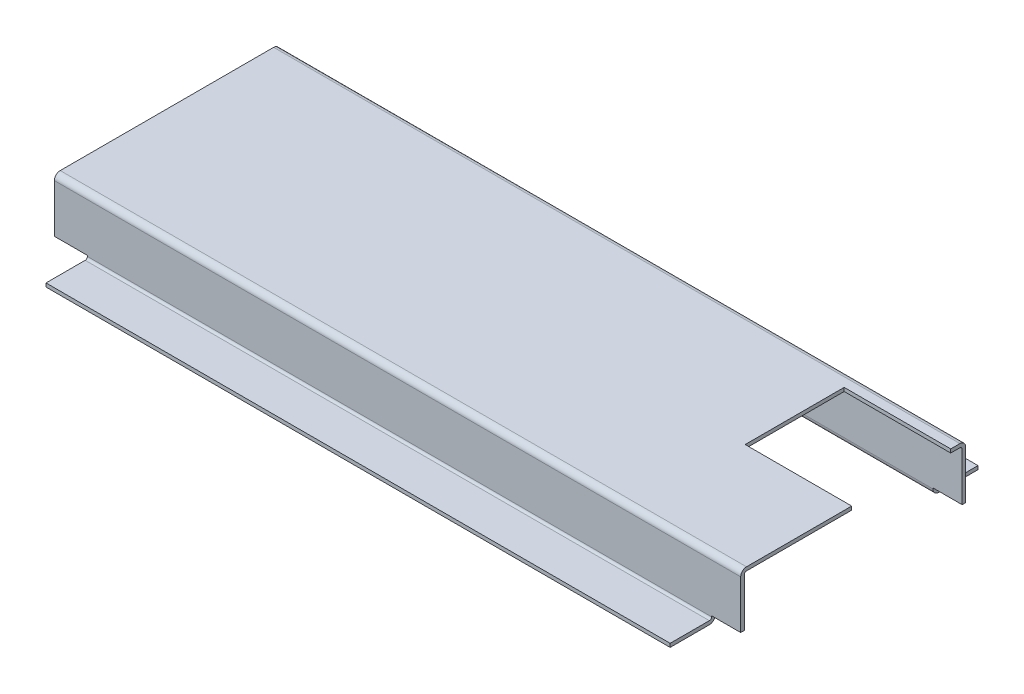
ISO-10303-21;
HEADER;
FILE_DESCRIPTION(('STEP AP214'),'2;1');
FILE_NAME('part.step','',(''),(''),'','','');
FILE_SCHEMA(('AUTOMOTIVE_DESIGN { 1 0 10303 214 1 1 1 1 }'));
ENDSEC;
DATA;
#1=APPLICATION_CONTEXT('core data for automotive mechanical design processes');
#2=APPLICATION_PROTOCOL_DEFINITION('international standard','automotive_design',2000,#1);
#3=PRODUCT_CONTEXT('',#1,'mechanical');
#4=PRODUCT('Part','Part','',(#3));
#5=PRODUCT_RELATED_PRODUCT_CATEGORY('part','',(#4));
#6=PRODUCT_DEFINITION_FORMATION('','',#4);
#7=PRODUCT_DEFINITION_CONTEXT('part definition',#1,'design');
#8=PRODUCT_DEFINITION('design','',#6,#7);
#9=PRODUCT_DEFINITION_SHAPE('','',#8);
#10=(LENGTH_UNIT() NAMED_UNIT(*) SI_UNIT(.MILLI.,.METRE.));
#11=(NAMED_UNIT(*) PLANE_ANGLE_UNIT() SI_UNIT($,.RADIAN.));
#12=(NAMED_UNIT(*) SI_UNIT($,.STERADIAN.) SOLID_ANGLE_UNIT());
#13=UNCERTAINTY_MEASURE_WITH_UNIT(LENGTH_MEASURE(1.E-05),#10,'distance_accuracy_value','');
#14=(GEOMETRIC_REPRESENTATION_CONTEXT(3) GLOBAL_UNCERTAINTY_ASSIGNED_CONTEXT((#13)) GLOBAL_UNIT_ASSIGNED_CONTEXT((#10,
#11,#12)) REPRESENTATION_CONTEXT('',''));
#15=CARTESIAN_POINT('',(0.,0.,0.));
#16=DIRECTION('',(0.,0.,1.));
#17=DIRECTION('',(1.,0.,0.));
#18=AXIS2_PLACEMENT_3D('',#15,#16,#17);
#19=CARTESIAN_POINT('',(-106.22,-18.0141,67.2));
#20=DIRECTION('',(1.,0.,0.));
#21=DIRECTION('',(0.,0.,-1.));
#22=AXIS2_PLACEMENT_3D('',#19,#20,#21);
#23=PLANE('',#22);
#24=DIRECTION('',(0.,0.,-1.));
#25=VECTOR('',#24,1.);
#26=CARTESIAN_POINT('',(-106.22,-18.0141,67.2));
#27=LINE('',#26,#25);
#28=CARTESIAN_POINT('',(-106.22,-18.0141,37.5));
#29=VERTEX_POINT('',#28);
#30=CARTESIAN_POINT('',(-106.22,-18.0141,36.3));
#31=VERTEX_POINT('',#30);
#32=EDGE_CURVE('E20',#29,#31,#27,.T.);
#33=ORIENTED_EDGE('',*,*,#32,.T.);
#34=DIRECTION('',(0.,-1.,0.));
#35=VECTOR('',#34,1.);
#36=CARTESIAN_POINT('',(-106.22,1.36491374571326E-13,36.3));
#37=LINE('',#36,#35);
#38=CARTESIAN_POINT('',(-106.22,-18.3275,36.3));
#39=VERTEX_POINT('',#38);
#40=EDGE_CURVE('E695',#31,#39,#37,.T.);
#41=ORIENTED_EDGE('',*,*,#40,.T.);
#42=CARTESIAN_POINT('',(-106.22,-18.3275,38.2366));
#43=DIRECTION('',(-1.,0.,0.));
#44=DIRECTION('',(0.,0.,-1.));
#45=AXIS2_PLACEMENT_3D('',#42,#43,#44);
#46=CIRCLE('',#45,1.9366);
#47=CARTESIAN_POINT('',(-106.22,-20.2641,38.2366));
#48=VERTEX_POINT('',#47);
#49=EDGE_CURVE('E299',#39,#48,#46,.T.);
#50=ORIENTED_EDGE('',*,*,#49,.T.);
#51=DIRECTION('',(0.,0.,-1.));
#52=VECTOR('',#51,1.);
#53=CARTESIAN_POINT('',(-106.22,-20.2641,0.));
#54=LINE('',#53,#52);
#55=CARTESIAN_POINT('',(-106.22,-20.2641,51.3));
#56=VERTEX_POINT('',#55);
#57=EDGE_CURVE('E297',#56,#48,#54,.T.);
#58=ORIENTED_EDGE('',*,*,#57,.F.);
#59=DIRECTION('',(0.,-1.,0.));
#60=VECTOR('',#59,1.);
#61=CARTESIAN_POINT('',(-106.22,-20.2641,51.3));
#62=LINE('',#61,#60);
#63=CARTESIAN_POINT('',(-106.22,-19.0641,51.3));
#64=VERTEX_POINT('',#63);
#65=EDGE_CURVE('E284',#64,#56,#62,.T.);
#66=ORIENTED_EDGE('',*,*,#65,.F.);
#67=DIRECTION('',(0.,0.,-1.));
#68=VECTOR('',#67,1.);
#69=CARTESIAN_POINT('',(-106.22,-19.0641,0.));
#70=LINE('',#69,#68);
#71=CARTESIAN_POINT('',(-106.22,-19.0641,38.2366));
#72=VERTEX_POINT('',#71);
#73=EDGE_CURVE('E438',#64,#72,#70,.T.);
#74=ORIENTED_EDGE('',*,*,#73,.T.);
#75=CARTESIAN_POINT('',(-106.22,-18.3275,38.2366));
#76=DIRECTION('',(-1.,0.,0.));
#77=DIRECTION('',(0.,0.,-1.));
#78=AXIS2_PLACEMENT_3D('',#75,#76,#77);
#79=CIRCLE('',#78,0.7366);
#80=CARTESIAN_POINT('',(-106.22,-18.3275,37.5));
#81=VERTEX_POINT('',#80);
#82=EDGE_CURVE('E521',#81,#72,#79,.T.);
#83=ORIENTED_EDGE('',*,*,#82,.F.);
#84=DIRECTION('',(0.,-1.,0.));
#85=VECTOR('',#84,1.);
#86=CARTESIAN_POINT('',(-106.22,1.40681152177937E-13,37.5));
#87=LINE('',#86,#85);
#88=EDGE_CURVE('E717',#29,#81,#87,.T.);
#89=ORIENTED_EDGE('',*,*,#88,.F.);
#90=EDGE_LOOP('',(#33,#41,#50,#58,#66,#74,#83,#89));
#91=FACE_BOUND('',#90,.T.);
#92=ADVANCED_FACE('F17',(#91),#23,.F.);
#93=CARTESIAN_POINT('',(-106.22,-18.0141,67.2));
#94=DIRECTION('',(1.,0.,0.));
#95=DIRECTION('',(0.,0.,-1.));
#96=AXIS2_PLACEMENT_3D('',#93,#94,#95);
#97=PLANE('',#96);
#98=CARTESIAN_POINT('',(-106.22,-18.3275,-38.2366));
#99=DIRECTION('',(-1.,0.,0.));
#100=DIRECTION('',(0.,0.,-1.));
#101=AXIS2_PLACEMENT_3D('',#98,#99,#100);
#102=CIRCLE('',#101,0.7366);
#103=CARTESIAN_POINT('',(-106.22,-19.0641,-38.2366));
#104=VERTEX_POINT('',#103);
#105=CARTESIAN_POINT('',(-106.22,-18.3275,-37.5));
#106=VERTEX_POINT('',#105);
#107=EDGE_CURVE('E494',#104,#106,#102,.T.);
#108=ORIENTED_EDGE('',*,*,#107,.F.);
#109=DIRECTION('',(0.,0.,-1.));
#110=VECTOR('',#109,1.);
#111=CARTESIAN_POINT('',(-106.22,-19.0641,0.));
#112=LINE('',#111,#110);
#113=CARTESIAN_POINT('',(-106.22,-19.0641,-51.3));
#114=VERTEX_POINT('',#113);
#115=EDGE_CURVE('E503',#104,#114,#112,.T.);
#116=ORIENTED_EDGE('',*,*,#115,.T.);
#117=DIRECTION('',(0.,1.,0.));
#118=VECTOR('',#117,1.);
#119=CARTESIAN_POINT('',(-106.22,-20.2641,-51.3));
#120=LINE('',#119,#118);
#121=CARTESIAN_POINT('',(-106.22,-20.2641,-51.3));
#122=VERTEX_POINT('',#121);
#123=EDGE_CURVE('E456',#122,#114,#120,.T.);
#124=ORIENTED_EDGE('',*,*,#123,.F.);
#125=DIRECTION('',(0.,0.,-1.));
#126=VECTOR('',#125,1.);
#127=CARTESIAN_POINT('',(-106.22,-20.2641,0.));
#128=LINE('',#127,#126);
#129=CARTESIAN_POINT('',(-106.22,-20.2641,-38.2366));
#130=VERTEX_POINT('',#129);
#131=EDGE_CURVE('E472',#130,#122,#128,.T.);
#132=ORIENTED_EDGE('',*,*,#131,.F.);
#133=CARTESIAN_POINT('',(-106.22,-18.3275,-38.2366));
#134=DIRECTION('',(-1.,0.,0.));
#135=DIRECTION('',(0.,0.,-1.));
#136=AXIS2_PLACEMENT_3D('',#133,#134,#135);
#137=CIRCLE('',#136,1.9366);
#138=CARTESIAN_POINT('',(-106.22,-18.3275,-36.3));
#139=VERTEX_POINT('',#138);
#140=EDGE_CURVE('E486',#130,#139,#137,.T.);
#141=ORIENTED_EDGE('',*,*,#140,.T.);
#142=DIRECTION('',(0.,1.,0.));
#143=VECTOR('',#142,1.);
#144=CARTESIAN_POINT('',(-106.22,1.36491374571326E-13,-36.3));
#145=LINE('',#144,#143);
#146=CARTESIAN_POINT('',(-106.22,-18.0141,-36.3));
#147=VERTEX_POINT('',#146);
#148=EDGE_CURVE('E351',#139,#147,#145,.T.);
#149=ORIENTED_EDGE('',*,*,#148,.T.);
#150=DIRECTION('',(0.,0.,-1.));
#151=VECTOR('',#150,1.);
#152=CARTESIAN_POINT('',(-106.22,-18.0141,67.2));
#153=LINE('',#152,#151);
#154=CARTESIAN_POINT('',(-106.22,-18.0141,-37.5));
#155=VERTEX_POINT('',#154);
#156=EDGE_CURVE('E27',#147,#155,#153,.T.);
#157=ORIENTED_EDGE('',*,*,#156,.T.);
#158=DIRECTION('',(0.,1.,0.));
#159=VECTOR('',#158,1.);
#160=CARTESIAN_POINT('',(-106.22,1.40681152177937E-13,-37.5));
#161=LINE('',#160,#159);
#162=EDGE_CURVE('E327',#106,#155,#161,.T.);
#163=ORIENTED_EDGE('',*,*,#162,.F.);
#164=EDGE_LOOP('',(#108,#116,#124,#132,#141,#149,#157,#163));
#165=FACE_BOUND('',#164,.T.);
#166=ADVANCED_FACE('F618',(#165),#97,.F.);
#167=CARTESIAN_POINT('',(-117.22,1.52233241171181,67.2));
#168=DIRECTION('',(1.,0.,0.));
#169=DIRECTION('',(0.,0.,-1.));
#170=AXIS2_PLACEMENT_3D('',#167,#168,#169);
#171=PLANE('',#170);
#172=DIRECTION('',(0.,0.,-1.));
#173=VECTOR('',#172,1.);
#174=CARTESIAN_POINT('',(-117.22,-18.0141,67.2));
#175=LINE('',#174,#173);
#176=CARTESIAN_POINT('',(-117.22,-18.0141,-36.3));
#177=VERTEX_POINT('',#176);
#178=CARTESIAN_POINT('',(-117.22,-18.0141,-37.5));
#179=VERTEX_POINT('',#178);
#180=EDGE_CURVE('E11',#177,#179,#175,.T.);
#181=ORIENTED_EDGE('',*,*,#180,.F.);
#182=DIRECTION('',(0.,1.,0.));
#183=VECTOR('',#182,1.);
#184=CARTESIAN_POINT('',(-117.22,1.36491374571326E-13,-36.3));
#185=LINE('',#184,#183);
#186=CARTESIAN_POINT('',(-117.22,-1.9366,-36.3));
#187=VERTEX_POINT('',#186);
#188=EDGE_CURVE('E387',#177,#187,#185,.T.);
#189=ORIENTED_EDGE('',*,*,#188,.T.);
#190=CARTESIAN_POINT('',(-117.22,-1.9366,-35.5634));
#191=DIRECTION('',(-1.,0.,0.));
#192=DIRECTION('',(0.,0.,-1.));
#193=AXIS2_PLACEMENT_3D('',#190,#191,#192);
#194=CIRCLE('',#193,0.736599999999983);
#195=CARTESIAN_POINT('',(-117.22,-1.2,-35.5634));
#196=VERTEX_POINT('',#195);
#197=EDGE_CURVE('E343',#196,#187,#194,.T.);
#198=ORIENTED_EDGE('',*,*,#197,.F.);
#199=DIRECTION('',(0.,0.,-1.));
#200=VECTOR('',#199,1.);
#201=CARTESIAN_POINT('',(-117.22,-1.2,0.));
#202=LINE('',#201,#200);
#203=CARTESIAN_POINT('',(-117.22,-1.2,35.5634));
#204=VERTEX_POINT('',#203);
#205=EDGE_CURVE('E417',#204,#196,#202,.T.);
#206=ORIENTED_EDGE('',*,*,#205,.F.);
#207=CARTESIAN_POINT('',(-117.22,-1.9366,35.5634));
#208=DIRECTION('',(-1.,0.,0.));
#209=DIRECTION('',(0.,0.,-1.));
#210=AXIS2_PLACEMENT_3D('',#207,#208,#209);
#211=CIRCLE('',#210,0.736599999999983);
#212=CARTESIAN_POINT('',(-117.22,-1.9366,36.3));
#213=VERTEX_POINT('',#212);
#214=EDGE_CURVE('E481',#213,#204,#211,.T.);
#215=ORIENTED_EDGE('',*,*,#214,.F.);
#216=DIRECTION('',(0.,-1.,0.));
#217=VECTOR('',#216,1.);
#218=CARTESIAN_POINT('',(-117.22,1.36491374571326E-13,36.3));
#219=LINE('',#218,#217);
#220=CARTESIAN_POINT('',(-117.22,-18.0141,36.3));
#221=VERTEX_POINT('',#220);
#222=EDGE_CURVE('E578',#213,#221,#219,.T.);
#223=ORIENTED_EDGE('',*,*,#222,.T.);
#224=DIRECTION('',(0.,0.,-1.));
#225=VECTOR('',#224,1.);
#226=CARTESIAN_POINT('',(-117.22,-18.0141,67.2));
#227=LINE('',#226,#225);
#228=CARTESIAN_POINT('',(-117.22,-18.0141,37.5));
#229=VERTEX_POINT('',#228);
#230=EDGE_CURVE('E352',#229,#221,#227,.T.);
#231=ORIENTED_EDGE('',*,*,#230,.F.);
#232=DIRECTION('',(0.,-1.,0.));
#233=VECTOR('',#232,1.);
#234=CARTESIAN_POINT('',(-117.22,1.40681152177937E-13,37.5));
#235=LINE('',#234,#233);
#236=CARTESIAN_POINT('',(-117.22,-1.9366,37.5));
#237=VERTEX_POINT('',#236);
#238=EDGE_CURVE('E691',#237,#229,#235,.T.);
#239=ORIENTED_EDGE('',*,*,#238,.F.);
#240=CARTESIAN_POINT('',(-117.22,-1.9366,35.5634));
#241=DIRECTION('',(-1.,0.,0.));
#242=DIRECTION('',(0.,0.,-1.));
#243=AXIS2_PLACEMENT_3D('',#240,#241,#242);
#244=CIRCLE('',#243,1.9366);
#245=CARTESIAN_POINT('',(-117.22,0.,35.5634));
#246=VERTEX_POINT('',#245);
#247=EDGE_CURVE('E342',#237,#246,#244,.T.);
#248=ORIENTED_EDGE('',*,*,#247,.T.);
#249=DIRECTION('',(0.,0.,-1.));
#250=VECTOR('',#249,1.);
#251=CARTESIAN_POINT('',(-117.22,0.,0.));
#252=LINE('',#251,#250);
#253=CARTESIAN_POINT('',(-117.22,0.,-35.5634));
#254=VERTEX_POINT('',#253);
#255=EDGE_CURVE('E448',#246,#254,#252,.T.);
#256=ORIENTED_EDGE('',*,*,#255,.T.);
#257=CARTESIAN_POINT('',(-117.22,-1.9366,-35.5634));
#258=DIRECTION('',(-1.,0.,0.));
#259=DIRECTION('',(0.,0.,-1.));
#260=AXIS2_PLACEMENT_3D('',#257,#258,#259);
#261=CIRCLE('',#260,1.9366);
#262=CARTESIAN_POINT('',(-117.22,-1.9366,-37.5));
#263=VERTEX_POINT('',#262);
#264=EDGE_CURVE('E451',#254,#263,#261,.T.);
#265=ORIENTED_EDGE('',*,*,#264,.T.);
#266=DIRECTION('',(0.,1.,0.));
#267=VECTOR('',#266,1.);
#268=CARTESIAN_POINT('',(-117.22,1.40681152177937E-13,-37.5));
#269=LINE('',#268,#267);
#270=EDGE_CURVE('E332',#179,#263,#269,.T.);
#271=ORIENTED_EDGE('',*,*,#270,.F.);
#272=EDGE_LOOP('',(#181,#189,#198,#206,#215,#223,#231,#239,#248,#256,#265,#271));
#273=FACE_BOUND('',#272,.T.);
#274=ADVANCED_FACE('F623',(#273),#171,.F.);
#275=CARTESIAN_POINT('',(-106.22,-18.0141,67.2));
#276=DIRECTION('',(0.,1.,0.));
#277=DIRECTION('',(1.,0.,0.));
#278=AXIS2_PLACEMENT_3D('',#275,#276,#277);
#279=PLANE('',#278);
#280=ORIENTED_EDGE('',*,*,#156,.F.);
#281=DIRECTION('',(-1.,0.,0.));
#282=VECTOR('',#281,1.);
#283=CARTESIAN_POINT('',(0.,-18.0141,-36.3));
#284=LINE('',#283,#282);
#285=EDGE_CURVE('E403',#147,#177,#284,.T.);
#286=ORIENTED_EDGE('',*,*,#285,.T.);
#287=ORIENTED_EDGE('',*,*,#180,.T.);
#288=DIRECTION('',(-1.,0.,0.));
#289=VECTOR('',#288,1.);
#290=CARTESIAN_POINT('',(0.,-18.0141,-37.5));
#291=LINE('',#290,#289);
#292=EDGE_CURVE('E331',#155,#179,#291,.T.);
#293=ORIENTED_EDGE('',*,*,#292,.F.);
#294=EDGE_LOOP('',(#280,#286,#287,#293));
#295=FACE_BOUND('',#294,.T.);
#296=ADVANCED_FACE('F630',(#295),#279,.F.);
#297=CARTESIAN_POINT('',(-106.22,-18.0141,67.2));
#298=DIRECTION('',(0.,1.,0.));
#299=DIRECTION('',(1.,0.,0.));
#300=AXIS2_PLACEMENT_3D('',#297,#298,#299);
#301=PLANE('',#300);
#302=ORIENTED_EDGE('',*,*,#230,.T.);
#303=DIRECTION('',(1.,0.,0.));
#304=VECTOR('',#303,1.);
#305=CARTESIAN_POINT('',(0.,-18.0141,36.3));
#306=LINE('',#305,#304);
#307=EDGE_CURVE('E698',#221,#31,#306,.T.);
#308=ORIENTED_EDGE('',*,*,#307,.T.);
#309=ORIENTED_EDGE('',*,*,#32,.F.);
#310=DIRECTION('',(1.,0.,0.));
#311=VECTOR('',#310,1.);
#312=CARTESIAN_POINT('',(0.,-18.0141,37.5));
#313=LINE('',#312,#311);
#314=EDGE_CURVE('E722',#229,#29,#313,.T.);
#315=ORIENTED_EDGE('',*,*,#314,.F.);
#316=EDGE_LOOP('',(#302,#308,#309,#315));
#317=FACE_BOUND('',#316,.T.);
#318=ADVANCED_FACE('F656',(#317),#301,.F.);
#319=CARTESIAN_POINT('',(111.510053750461,0.625597061701889,67.2));
#320=DIRECTION('',(-1.,0.,0.));
#321=DIRECTION('',(0.,1.,0.));
#322=AXIS2_PLACEMENT_3D('',#319,#320,#321);
#323=PLANE('',#322);
#324=DIRECTION('',(0.,0.,-1.));
#325=VECTOR('',#324,1.);
#326=CARTESIAN_POINT('',(111.510053750461,-18.0141,67.2));
#327=LINE('',#326,#325);
#328=CARTESIAN_POINT('',(111.510053750461,-18.0141,37.5));
#329=VERTEX_POINT('',#328);
#330=CARTESIAN_POINT('',(111.510053750461,-18.0141,36.3));
#331=VERTEX_POINT('',#330);
#332=EDGE_CURVE('E355',#329,#331,#327,.T.);
#333=ORIENTED_EDGE('',*,*,#332,.T.);
#334=DIRECTION('',(0.,1.,0.));
#335=VECTOR('',#334,1.);
#336=CARTESIAN_POINT('',(111.510053750461,1.36491374571326E-13,36.3));
#337=LINE('',#336,#335);
#338=CARTESIAN_POINT('',(111.510053750461,-1.9366,36.3));
#339=VERTEX_POINT('',#338);
#340=EDGE_CURVE('E552',#331,#339,#337,.T.);
#341=ORIENTED_EDGE('',*,*,#340,.T.);
#342=CARTESIAN_POINT('',(111.510053750461,-1.9366,35.5634));
#343=DIRECTION('',(1.,0.,0.));
#344=DIRECTION('',(0.,0.,1.));
#345=AXIS2_PLACEMENT_3D('',#342,#343,#344);
#346=CIRCLE('',#345,0.736599999999983);
#347=CARTESIAN_POINT('',(111.510053750461,-1.2,35.5634));
#348=VERTEX_POINT('',#347);
#349=EDGE_CURVE('E485',#348,#339,#346,.T.);
#350=ORIENTED_EDGE('',*,*,#349,.F.);
#351=DIRECTION('',(0.,0.,1.));
#352=VECTOR('',#351,1.);
#353=CARTESIAN_POINT('',(111.510053750461,-1.2,0.));
#354=LINE('',#353,#352);
#355=CARTESIAN_POINT('',(111.510053750461,-1.2,0.499999999999952));
#356=VERTEX_POINT('',#355);
#357=EDGE_CURVE('E444',#356,#348,#354,.T.);
#358=ORIENTED_EDGE('',*,*,#357,.F.);
#359=DIRECTION('',(0.,-1.,0.));
#360=VECTOR('',#359,1.);
#361=CARTESIAN_POINT('',(111.510053750461,-20.2641,0.499999999999952));
#362=LINE('',#361,#360);
#363=CARTESIAN_POINT('',(111.510053750461,0.,0.499999999999952));
#364=VERTEX_POINT('',#363);
#365=EDGE_CURVE('E396',#364,#356,#362,.T.);
#366=ORIENTED_EDGE('',*,*,#365,.F.);
#367=DIRECTION('',(0.,0.,1.));
#368=VECTOR('',#367,1.);
#369=CARTESIAN_POINT('',(111.510053750461,0.,0.));
#370=LINE('',#369,#368);
#371=CARTESIAN_POINT('',(111.510053750461,0.,35.5634));
#372=VERTEX_POINT('',#371);
#373=EDGE_CURVE('E464',#364,#372,#370,.T.);
#374=ORIENTED_EDGE('',*,*,#373,.T.);
#375=CARTESIAN_POINT('',(111.510053750461,-1.9366,35.5634));
#376=DIRECTION('',(1.,0.,0.));
#377=DIRECTION('',(0.,0.,1.));
#378=AXIS2_PLACEMENT_3D('',#375,#376,#377);
#379=CIRCLE('',#378,1.9366);
#380=CARTESIAN_POINT('',(111.510053750461,-1.9366,37.5));
#381=VERTEX_POINT('',#380);
#382=EDGE_CURVE('E478',#372,#381,#379,.T.);
#383=ORIENTED_EDGE('',*,*,#382,.T.);
#384=DIRECTION('',(0.,1.,0.));
#385=VECTOR('',#384,1.);
#386=CARTESIAN_POINT('',(111.510053750461,1.40681152177937E-13,37.5));
#387=LINE('',#386,#385);
#388=EDGE_CURVE('E555',#329,#381,#387,.T.);
#389=ORIENTED_EDGE('',*,*,#388,.F.);
#390=EDGE_LOOP('',(#333,#341,#350,#358,#366,#374,#383,#389));
#391=FACE_BOUND('',#390,.T.);
#392=ADVANCED_FACE('F550',(#391),#323,.F.);
#393=CARTESIAN_POINT('',(101.806,-18.0141,67.2));
#394=DIRECTION('',(-1.,0.,0.));
#395=DIRECTION('',(0.,1.,0.));
#396=AXIS2_PLACEMENT_3D('',#393,#394,#395);
#397=PLANE('',#396);
#398=CARTESIAN_POINT('',(101.806,-18.3275,38.2366));
#399=DIRECTION('',(1.,0.,0.));
#400=DIRECTION('',(0.,0.,1.));
#401=AXIS2_PLACEMENT_3D('',#398,#399,#400);
#402=CIRCLE('',#401,0.7366);
#403=CARTESIAN_POINT('',(101.806,-19.0641,38.2366));
#404=VERTEX_POINT('',#403);
#405=CARTESIAN_POINT('',(101.806,-18.3275,37.5));
#406=VERTEX_POINT('',#405);
#407=EDGE_CURVE('E309',#404,#406,#402,.T.);
#408=ORIENTED_EDGE('',*,*,#407,.F.);
#409=DIRECTION('',(0.,0.,1.));
#410=VECTOR('',#409,1.);
#411=CARTESIAN_POINT('',(101.806,-19.0641,0.));
#412=LINE('',#411,#410);
#413=CARTESIAN_POINT('',(101.806,-19.0641,51.3));
#414=VERTEX_POINT('',#413);
#415=EDGE_CURVE('E294',#404,#414,#412,.T.);
#416=ORIENTED_EDGE('',*,*,#415,.T.);
#417=DIRECTION('',(0.,1.,0.));
#418=VECTOR('',#417,1.);
#419=CARTESIAN_POINT('',(101.806,-20.2641,51.3));
#420=LINE('',#419,#418);
#421=CARTESIAN_POINT('',(101.806,-20.2641,51.3));
#422=VERTEX_POINT('',#421);
#423=EDGE_CURVE('E41',#422,#414,#420,.T.);
#424=ORIENTED_EDGE('',*,*,#423,.F.);
#425=DIRECTION('',(0.,0.,1.));
#426=VECTOR('',#425,1.);
#427=CARTESIAN_POINT('',(101.806,-20.2641,0.));
#428=LINE('',#427,#426);
#429=CARTESIAN_POINT('',(101.806,-20.2641,38.2366));
#430=VERTEX_POINT('',#429);
#431=EDGE_CURVE('E304',#430,#422,#428,.T.);
#432=ORIENTED_EDGE('',*,*,#431,.F.);
#433=CARTESIAN_POINT('',(101.806,-18.3275,38.2366));
#434=DIRECTION('',(1.,0.,0.));
#435=DIRECTION('',(0.,0.,1.));
#436=AXIS2_PLACEMENT_3D('',#433,#434,#435);
#437=CIRCLE('',#436,1.9366);
#438=CARTESIAN_POINT('',(101.806,-18.3275,36.3));
#439=VERTEX_POINT('',#438);
#440=EDGE_CURVE('E517',#430,#439,#437,.T.);
#441=ORIENTED_EDGE('',*,*,#440,.T.);
#442=DIRECTION('',(0.,1.,0.));
#443=VECTOR('',#442,1.);
#444=CARTESIAN_POINT('',(101.806,1.36491374571326E-13,36.3));
#445=LINE('',#444,#443);
#446=CARTESIAN_POINT('',(101.806,-18.0141,36.3));
#447=VERTEX_POINT('',#446);
#448=EDGE_CURVE('E566',#439,#447,#445,.T.);
#449=ORIENTED_EDGE('',*,*,#448,.T.);
#450=DIRECTION('',(0.,0.,-1.));
#451=VECTOR('',#450,1.);
#452=CARTESIAN_POINT('',(101.806,-18.0141,67.2));
#453=LINE('',#452,#451);
#454=CARTESIAN_POINT('',(101.806,-18.0141,37.5));
#455=VERTEX_POINT('',#454);
#456=EDGE_CURVE('E388',#455,#447,#453,.T.);
#457=ORIENTED_EDGE('',*,*,#456,.F.);
#458=DIRECTION('',(0.,1.,0.));
#459=VECTOR('',#458,1.);
#460=CARTESIAN_POINT('',(101.806,1.40681152177937E-13,37.5));
#461=LINE('',#460,#459);
#462=EDGE_CURVE('E731',#406,#455,#461,.T.);
#463=ORIENTED_EDGE('',*,*,#462,.F.);
#464=EDGE_LOOP('',(#408,#416,#424,#432,#441,#449,#457,#463));
#465=FACE_BOUND('',#464,.T.);
#466=ADVANCED_FACE('F595',(#465),#397,.F.);
#467=CARTESIAN_POINT('',(111.510053750461,-18.0141,67.2));
#468=DIRECTION('',(0.,1.,0.));
#469=DIRECTION('',(0.,0.,-1.));
#470=AXIS2_PLACEMENT_3D('',#467,#468,#469);
#471=PLANE('',#470);
#472=ORIENTED_EDGE('',*,*,#456,.T.);
#473=DIRECTION('',(1.,0.,0.));
#474=VECTOR('',#473,1.);
#475=CARTESIAN_POINT('',(0.,-18.0141,36.3));
#476=LINE('',#475,#474);
#477=EDGE_CURVE('E560',#447,#331,#476,.T.);
#478=ORIENTED_EDGE('',*,*,#477,.T.);
#479=ORIENTED_EDGE('',*,*,#332,.F.);
#480=DIRECTION('',(1.,0.,0.));
#481=VECTOR('',#480,1.);
#482=CARTESIAN_POINT('',(0.,-18.0141,37.5));
#483=LINE('',#482,#481);
#484=EDGE_CURVE('E728',#455,#329,#483,.T.);
#485=ORIENTED_EDGE('',*,*,#484,.F.);
#486=EDGE_LOOP('',(#472,#478,#479,#485));
#487=FACE_BOUND('',#486,.T.);
#488=ADVANCED_FACE('F561',(#487),#471,.F.);
#489=CARTESIAN_POINT('',(111.510053750461,-18.0141,67.2));
#490=DIRECTION('',(0.,1.,0.));
#491=DIRECTION('',(0.,0.,-1.));
#492=AXIS2_PLACEMENT_3D('',#489,#490,#491);
#493=PLANE('',#492);
#494=DIRECTION('',(0.,0.,-1.));
#495=VECTOR('',#494,1.);
#496=CARTESIAN_POINT('',(111.510053750461,-18.0141,67.2));
#497=LINE('',#496,#495);
#498=CARTESIAN_POINT('',(111.510053750461,-18.0141,-36.3));
#499=VERTEX_POINT('',#498);
#500=CARTESIAN_POINT('',(111.510053750461,-18.0141,-37.5));
#501=VERTEX_POINT('',#500);
#502=EDGE_CURVE('E391',#499,#501,#497,.T.);
#503=ORIENTED_EDGE('',*,*,#502,.F.);
#504=DIRECTION('',(-1.,0.,0.));
#505=VECTOR('',#504,1.);
#506=CARTESIAN_POINT('',(0.,-18.0141,-36.3));
#507=LINE('',#506,#505);
#508=CARTESIAN_POINT('',(101.806,-18.0141,-36.3));
#509=VERTEX_POINT('',#508);
#510=EDGE_CURVE('E364',#499,#509,#507,.T.);
#511=ORIENTED_EDGE('',*,*,#510,.T.);
#512=DIRECTION('',(0.,0.,-1.));
#513=VECTOR('',#512,1.);
#514=CARTESIAN_POINT('',(101.806,-18.0141,67.2));
#515=LINE('',#514,#513);
#516=CARTESIAN_POINT('',(101.806,-18.0141,-37.5));
#517=VERTEX_POINT('',#516);
#518=EDGE_CURVE('E395',#509,#517,#515,.T.);
#519=ORIENTED_EDGE('',*,*,#518,.T.);
#520=DIRECTION('',(-1.,0.,0.));
#521=VECTOR('',#520,1.);
#522=CARTESIAN_POINT('',(0.,-18.0141,-37.5));
#523=LINE('',#522,#521);
#524=EDGE_CURVE('E325',#501,#517,#523,.T.);
#525=ORIENTED_EDGE('',*,*,#524,.F.);
#526=EDGE_LOOP('',(#503,#511,#519,#525));
#527=FACE_BOUND('',#526,.T.);
#528=ADVANCED_FACE('F645',(#527),#493,.F.);
#529=CARTESIAN_POINT('',(111.510053750461,0.625597061701889,67.2));
#530=DIRECTION('',(-1.,0.,0.));
#531=DIRECTION('',(0.,1.,0.));
#532=AXIS2_PLACEMENT_3D('',#529,#530,#531);
#533=PLANE('',#532);
#534=CARTESIAN_POINT('',(111.510053750461,-1.9366,-35.5634));
#535=DIRECTION('',(1.,0.,0.));
#536=DIRECTION('',(0.,0.,1.));
#537=AXIS2_PLACEMENT_3D('',#534,#535,#536);
#538=CIRCLE('',#537,1.9366);
#539=CARTESIAN_POINT('',(111.510053750461,-1.9366,-37.5));
#540=VERTEX_POINT('',#539);
#541=CARTESIAN_POINT('',(111.510053750461,0.,-35.5634));
#542=VERTEX_POINT('',#541);
#543=EDGE_CURVE('E346',#540,#542,#538,.T.);
#544=ORIENTED_EDGE('',*,*,#543,.T.);
#545=DIRECTION('',(0.,0.,1.));
#546=VECTOR('',#545,1.);
#547=CARTESIAN_POINT('',(111.510053750461,0.,0.));
#548=LINE('',#547,#546);
#549=CARTESIAN_POINT('',(111.510053750461,0.,-32.5));
#550=VERTEX_POINT('',#549);
#551=EDGE_CURVE('E369',#542,#550,#548,.T.);
#552=ORIENTED_EDGE('',*,*,#551,.T.);
#553=DIRECTION('',(0.,1.,0.));
#554=VECTOR('',#553,1.);
#555=CARTESIAN_POINT('',(111.510053750461,-20.2641,-32.5));
#556=LINE('',#555,#554);
#557=CARTESIAN_POINT('',(111.510053750461,-1.2,-32.5));
#558=VERTEX_POINT('',#557);
#559=EDGE_CURVE('E392',#558,#550,#556,.T.);
#560=ORIENTED_EDGE('',*,*,#559,.F.);
#561=DIRECTION('',(0.,0.,1.));
#562=VECTOR('',#561,1.);
#563=CARTESIAN_POINT('',(111.510053750461,-1.2,0.));
#564=LINE('',#563,#562);
#565=CARTESIAN_POINT('',(111.510053750461,-1.2,-35.5634));
#566=VERTEX_POINT('',#565);
#567=EDGE_CURVE('E425',#566,#558,#564,.T.);
#568=ORIENTED_EDGE('',*,*,#567,.F.);
#569=CARTESIAN_POINT('',(111.510053750461,-1.9366,-35.5634));
#570=DIRECTION('',(1.,0.,0.));
#571=DIRECTION('',(0.,0.,1.));
#572=AXIS2_PLACEMENT_3D('',#569,#570,#571);
#573=CIRCLE('',#572,0.736599999999983);
#574=CARTESIAN_POINT('',(111.510053750461,-1.9366,-36.3));
#575=VERTEX_POINT('',#574);
#576=EDGE_CURVE('E339',#575,#566,#573,.T.);
#577=ORIENTED_EDGE('',*,*,#576,.F.);
#578=DIRECTION('',(0.,-1.,0.));
#579=VECTOR('',#578,1.);
#580=CARTESIAN_POINT('',(111.510053750461,1.36491374571326E-13,-36.3));
#581=LINE('',#580,#579);
#582=EDGE_CURVE('E368',#575,#499,#581,.T.);
#583=ORIENTED_EDGE('',*,*,#582,.T.);
#584=ORIENTED_EDGE('',*,*,#502,.T.);
#585=DIRECTION('',(0.,-1.,0.));
#586=VECTOR('',#585,1.);
#587=CARTESIAN_POINT('',(111.510053750461,1.40681152177937E-13,-37.5));
#588=LINE('',#587,#586);
#589=EDGE_CURVE('E321',#540,#501,#588,.T.);
#590=ORIENTED_EDGE('',*,*,#589,.F.);
#591=EDGE_LOOP('',(#544,#552,#560,#568,#577,#583,#584,#590));
#592=FACE_BOUND('',#591,.T.);
#593=ADVANCED_FACE('F641',(#592),#533,.F.);
#594=CARTESIAN_POINT('',(101.806,-18.0141,67.2));
#595=DIRECTION('',(-1.,0.,0.));
#596=DIRECTION('',(0.,1.,0.));
#597=AXIS2_PLACEMENT_3D('',#594,#595,#596);
#598=PLANE('',#597);
#599=ORIENTED_EDGE('',*,*,#518,.F.);
#600=DIRECTION('',(0.,-1.,0.));
#601=VECTOR('',#600,1.);
#602=CARTESIAN_POINT('',(101.806,1.36491374571326E-13,-36.3));
#603=LINE('',#602,#601);
#604=CARTESIAN_POINT('',(101.806,-18.3275,-36.3));
#605=VERTEX_POINT('',#604);
#606=EDGE_CURVE('E363',#509,#605,#603,.T.);
#607=ORIENTED_EDGE('',*,*,#606,.T.);
#608=CARTESIAN_POINT('',(101.806,-18.3275,-38.2366));
#609=DIRECTION('',(1.,0.,0.));
#610=DIRECTION('',(0.,0.,1.));
#611=AXIS2_PLACEMENT_3D('',#608,#609,#610);
#612=CIRCLE('',#611,1.9366);
#613=CARTESIAN_POINT('',(101.806,-20.2641,-38.2366));
#614=VERTEX_POINT('',#613);
#615=EDGE_CURVE('E408',#605,#614,#612,.T.);
#616=ORIENTED_EDGE('',*,*,#615,.T.);
#617=DIRECTION('',(0.,0.,1.));
#618=VECTOR('',#617,1.);
#619=CARTESIAN_POINT('',(101.806,-20.2641,0.));
#620=LINE('',#619,#618);
#621=CARTESIAN_POINT('',(101.806,-20.2641,-51.3));
#622=VERTEX_POINT('',#621);
#623=EDGE_CURVE('E500',#622,#614,#620,.T.);
#624=ORIENTED_EDGE('',*,*,#623,.F.);
#625=DIRECTION('',(0.,-1.,0.));
#626=VECTOR('',#625,1.);
#627=CARTESIAN_POINT('',(101.806,-20.2641,-51.3));
#628=LINE('',#627,#626);
#629=CARTESIAN_POINT('',(101.806,-19.0641,-51.3));
#630=VERTEX_POINT('',#629);
#631=EDGE_CURVE('E459',#630,#622,#628,.T.);
#632=ORIENTED_EDGE('',*,*,#631,.F.);
#633=DIRECTION('',(0.,0.,1.));
#634=VECTOR('',#633,1.);
#635=CARTESIAN_POINT('',(101.806,-19.0641,0.));
#636=LINE('',#635,#634);
#637=CARTESIAN_POINT('',(101.806,-19.0641,-38.2366));
#638=VERTEX_POINT('',#637);
#639=EDGE_CURVE('E507',#630,#638,#636,.T.);
#640=ORIENTED_EDGE('',*,*,#639,.T.);
#641=CARTESIAN_POINT('',(101.806,-18.3275,-38.2366));
#642=DIRECTION('',(1.,0.,0.));
#643=DIRECTION('',(0.,0.,1.));
#644=AXIS2_PLACEMENT_3D('',#641,#642,#643);
#645=CIRCLE('',#644,0.7366);
#646=CARTESIAN_POINT('',(101.806,-18.3275,-37.5));
#647=VERTEX_POINT('',#646);
#648=EDGE_CURVE('E477',#647,#638,#645,.T.);
#649=ORIENTED_EDGE('',*,*,#648,.F.);
#650=DIRECTION('',(0.,-1.,0.));
#651=VECTOR('',#650,1.);
#652=CARTESIAN_POINT('',(101.806,1.40681152177937E-13,-37.5));
#653=LINE('',#652,#651);
#654=EDGE_CURVE('E347',#517,#647,#653,.T.);
#655=ORIENTED_EDGE('',*,*,#654,.F.);
#656=EDGE_LOOP('',(#599,#607,#616,#624,#632,#640,#649,#655));
#657=FACE_BOUND('',#656,.T.);
#658=ADVANCED_FACE('F637',(#657),#598,.F.);
#659=CARTESIAN_POINT('',(76.,-20.2641,-32.5));
#660=DIRECTION('',(0.,0.,-1.));
#661=DIRECTION('',(0.,-1.,0.));
#662=AXIS2_PLACEMENT_3D('',#659,#660,#661);
#663=PLANE('',#662);
#664=DIRECTION('',(-1.,0.,0.));
#665=VECTOR('',#664,1.);
#666=CARTESIAN_POINT('',(0.,-1.2,-32.5));
#667=LINE('',#666,#665);
#668=CARTESIAN_POINT('',(76.,-1.2,-32.5));
#669=VERTEX_POINT('',#668);
#670=EDGE_CURVE('E429',#558,#669,#667,.T.);
#671=ORIENTED_EDGE('',*,*,#670,.F.);
#672=ORIENTED_EDGE('',*,*,#559,.T.);
#673=DIRECTION('',(-1.,0.,0.));
#674=VECTOR('',#673,1.);
#675=CARTESIAN_POINT('',(76.,0.,-32.5));
#676=LINE('',#675,#674);
#677=CARTESIAN_POINT('',(76.,0.,-32.5));
#678=VERTEX_POINT('',#677);
#679=EDGE_CURVE('E374',#550,#678,#676,.T.);
#680=ORIENTED_EDGE('',*,*,#679,.T.);
#681=DIRECTION('',(0.,1.,0.));
#682=VECTOR('',#681,1.);
#683=CARTESIAN_POINT('',(76.,-20.2641,-32.5));
#684=LINE('',#683,#682);
#685=EDGE_CURVE('E534',#669,#678,#684,.T.);
#686=ORIENTED_EDGE('',*,*,#685,.F.);
#687=EDGE_LOOP('',(#671,#672,#680,#686));
#688=FACE_BOUND('',#687,.T.);
#689=ADVANCED_FACE('F640',(#688),#663,.F.);
#690=CARTESIAN_POINT('',(76.,-20.2641,0.499999999999952));
#691=DIRECTION('',(0.,0.,1.));
#692=DIRECTION('',(1.,0.,0.));
#693=AXIS2_PLACEMENT_3D('',#690,#691,#692);
#694=PLANE('',#693);
#695=DIRECTION('',(1.,0.,0.));
#696=VECTOR('',#695,1.);
#697=CARTESIAN_POINT('',(76.,0.,0.499999999999952));
#698=LINE('',#697,#696);
#699=CARTESIAN_POINT('',(76.,0.,0.499999999999952));
#700=VERTEX_POINT('',#699);
#701=EDGE_CURVE('E383',#700,#364,#698,.T.);
#702=ORIENTED_EDGE('',*,*,#701,.T.);
#703=ORIENTED_EDGE('',*,*,#365,.T.);
#704=DIRECTION('',(1.,0.,0.));
#705=VECTOR('',#704,1.);
#706=CARTESIAN_POINT('',(0.,-1.2,0.499999999999952));
#707=LINE('',#706,#705);
#708=CARTESIAN_POINT('',(76.,-1.2,0.499999999999952));
#709=VERTEX_POINT('',#708);
#710=EDGE_CURVE('E437',#709,#356,#707,.T.);
#711=ORIENTED_EDGE('',*,*,#710,.F.);
#712=DIRECTION('',(0.,1.,0.));
#713=VECTOR('',#712,1.);
#714=CARTESIAN_POINT('',(76.,-20.2641,0.499999999999952));
#715=LINE('',#714,#713);
#716=EDGE_CURVE('E537',#709,#700,#715,.T.);
#717=ORIENTED_EDGE('',*,*,#716,.T.);
#718=EDGE_LOOP('',(#702,#703,#711,#717));
#719=FACE_BOUND('',#718,.T.);
#720=ADVANCED_FACE('F783',(#719),#694,.F.);
#721=CARTESIAN_POINT('',(76.,-20.2641,0.499999999999952));
#722=DIRECTION('',(-1.,0.,0.));
#723=DIRECTION('',(0.,0.,1.));
#724=AXIS2_PLACEMENT_3D('',#721,#722,#723);
#725=PLANE('',#724);
#726=ORIENTED_EDGE('',*,*,#685,.T.);
#727=DIRECTION('',(0.,0.,1.));
#728=VECTOR('',#727,1.);
#729=CARTESIAN_POINT('',(76.,0.,0.499999999999952));
#730=LINE('',#729,#728);
#731=EDGE_CURVE('E379',#678,#700,#730,.T.);
#732=ORIENTED_EDGE('',*,*,#731,.T.);
#733=ORIENTED_EDGE('',*,*,#716,.F.);
#734=DIRECTION('',(0.,0.,1.));
#735=VECTOR('',#734,1.);
#736=CARTESIAN_POINT('',(76.,-1.2,0.));
#737=LINE('',#736,#735);
#738=EDGE_CURVE('E433',#669,#709,#737,.T.);
#739=ORIENTED_EDGE('',*,*,#738,.F.);
#740=EDGE_LOOP('',(#726,#732,#733,#739));
#741=FACE_BOUND('',#740,.T.);
#742=ADVANCED_FACE('F635',(#741),#725,.F.);
#743=CARTESIAN_POINT('',(-124.,-20.2641,51.3));
#744=DIRECTION('',(0.,0.,-1.));
#745=DIRECTION('',(0.,-1.,0.));
#746=AXIS2_PLACEMENT_3D('',#743,#744,#745);
#747=PLANE('',#746);
#748=DIRECTION('',(-1.,0.,0.));
#749=VECTOR('',#748,1.);
#750=CARTESIAN_POINT('',(-124.,-19.0641,51.3));
#751=LINE('',#750,#749);
#752=EDGE_CURVE('E290',#414,#64,#751,.T.);
#753=ORIENTED_EDGE('',*,*,#752,.T.);
#754=ORIENTED_EDGE('',*,*,#65,.T.);
#755=DIRECTION('',(-1.,0.,0.));
#756=VECTOR('',#755,1.);
#757=CARTESIAN_POINT('',(0.,-20.2641,51.3));
#758=LINE('',#757,#756);
#759=EDGE_CURVE('E288',#422,#56,#758,.T.);
#760=ORIENTED_EDGE('',*,*,#759,.F.);
#761=ORIENTED_EDGE('',*,*,#423,.T.);
#762=EDGE_LOOP('',(#753,#754,#760,#761));
#763=FACE_BOUND('',#762,.T.);
#764=ADVANCED_FACE('F286',(#763),#747,.F.);
#765=CARTESIAN_POINT('',(0.,-19.0641,0.));
#766=DIRECTION('',(0.,1.,0.));
#767=DIRECTION('',(0.,0.,-1.));
#768=AXIS2_PLACEMENT_3D('',#765,#766,#767);
#769=PLANE('',#768);
#770=ORIENTED_EDGE('',*,*,#73,.F.);
#771=ORIENTED_EDGE('',*,*,#752,.F.);
#772=ORIENTED_EDGE('',*,*,#415,.F.);
#773=DIRECTION('',(1.,0.,0.));
#774=VECTOR('',#773,1.);
#775=CARTESIAN_POINT('',(-124.,-19.0641,38.2366));
#776=LINE('',#775,#774);
#777=EDGE_CURVE('E315',#72,#404,#776,.T.);
#778=ORIENTED_EDGE('',*,*,#777,.F.);
#779=EDGE_LOOP('',(#770,#771,#772,#778));
#780=FACE_BOUND('',#779,.T.);
#781=ADVANCED_FACE('F1134',(#780),#769,.T.);
#782=CARTESIAN_POINT('',(0.,-20.2641,0.));
#783=DIRECTION('',(0.,1.,0.));
#784=DIRECTION('',(0.,0.,-1.));
#785=AXIS2_PLACEMENT_3D('',#782,#783,#784);
#786=PLANE('',#785);
#787=ORIENTED_EDGE('',*,*,#759,.T.);
#788=ORIENTED_EDGE('',*,*,#57,.T.);
#789=DIRECTION('',(-1.,0.,0.));
#790=VECTOR('',#789,1.);
#791=CARTESIAN_POINT('',(-124.,-20.2641,38.2366));
#792=LINE('',#791,#790);
#793=EDGE_CURVE('E518',#430,#48,#792,.T.);
#794=ORIENTED_EDGE('',*,*,#793,.F.);
#795=ORIENTED_EDGE('',*,*,#431,.T.);
#796=EDGE_LOOP('',(#787,#788,#794,#795));
#797=FACE_BOUND('',#796,.T.);
#798=ADVANCED_FACE('F307',(#797),#786,.F.);
#799=CARTESIAN_POINT('',(124.,-18.3275,38.2366));
#800=DIRECTION('',(1.,0.,0.));
#801=DIRECTION('',(0.,-1.,0.));
#802=AXIS2_PLACEMENT_3D('',#799,#800,#801);
#803=CYLINDRICAL_SURFACE('',#802,0.7366);
#804=DIRECTION('',(-1.,0.,0.));
#805=VECTOR('',#804,1.);
#806=CARTESIAN_POINT('',(124.,-18.3275,37.5));
#807=LINE('',#806,#805);
#808=EDGE_CURVE('E721',#406,#81,#807,.T.);
#809=ORIENTED_EDGE('',*,*,#808,.T.);
#810=ORIENTED_EDGE('',*,*,#82,.T.);
#811=ORIENTED_EDGE('',*,*,#777,.T.);
#812=ORIENTED_EDGE('',*,*,#407,.T.);
#813=EDGE_LOOP('',(#809,#810,#811,#812));
#814=FACE_BOUND('',#813,.T.);
#815=ADVANCED_FACE('F604',(#814),#803,.F.);
#816=CARTESIAN_POINT('',(124.,-18.3275,38.2366));
#817=DIRECTION('',(1.,0.,0.));
#818=DIRECTION('',(0.,-1.,0.));
#819=AXIS2_PLACEMENT_3D('',#816,#817,#818);
#820=CYLINDRICAL_SURFACE('',#819,1.9366);
#821=ORIENTED_EDGE('',*,*,#49,.F.);
#822=DIRECTION('',(-1.,0.,0.));
#823=VECTOR('',#822,1.);
#824=CARTESIAN_POINT('',(124.,-18.3275,36.3));
#825=LINE('',#824,#823);
#826=EDGE_CURVE('E582',#439,#39,#825,.T.);
#827=ORIENTED_EDGE('',*,*,#826,.F.);
#828=ORIENTED_EDGE('',*,*,#440,.F.);
#829=ORIENTED_EDGE('',*,*,#793,.T.);
#830=EDGE_LOOP('',(#821,#827,#828,#829));
#831=FACE_BOUND('',#830,.T.);
#832=ADVANCED_FACE('F601',(#831),#820,.T.);
#833=CARTESIAN_POINT('',(124.,-20.2641,-51.3));
#834=DIRECTION('',(0.,0.,1.));
#835=DIRECTION('',(0.,-1.,0.));
#836=AXIS2_PLACEMENT_3D('',#833,#834,#835);
#837=PLANE('',#836);
#838=DIRECTION('',(1.,0.,0.));
#839=VECTOR('',#838,1.);
#840=CARTESIAN_POINT('',(0.,-20.2641,-51.3));
#841=LINE('',#840,#839);
#842=EDGE_CURVE('E476',#122,#622,#841,.T.);
#843=ORIENTED_EDGE('',*,*,#842,.F.);
#844=ORIENTED_EDGE('',*,*,#123,.T.);
#845=DIRECTION('',(1.,0.,0.));
#846=VECTOR('',#845,1.);
#847=CARTESIAN_POINT('',(124.,-19.0641,-51.3));
#848=LINE('',#847,#846);
#849=EDGE_CURVE('E460',#114,#630,#848,.T.);
#850=ORIENTED_EDGE('',*,*,#849,.T.);
#851=ORIENTED_EDGE('',*,*,#631,.T.);
#852=EDGE_LOOP('',(#843,#844,#850,#851));
#853=FACE_BOUND('',#852,.T.);
#854=ADVANCED_FACE('F603',(#853),#837,.F.);
#855=CARTESIAN_POINT('',(0.,-19.0641,0.));
#856=DIRECTION('',(0.,1.,0.));
#857=DIRECTION('',(0.,0.,-1.));
#858=AXIS2_PLACEMENT_3D('',#855,#856,#857);
#859=PLANE('',#858);
#860=ORIENTED_EDGE('',*,*,#115,.F.);
#861=DIRECTION('',(-1.,0.,0.));
#862=VECTOR('',#861,1.);
#863=CARTESIAN_POINT('',(124.,-19.0641,-38.2366));
#864=LINE('',#863,#862);
#865=EDGE_CURVE('E412',#638,#104,#864,.T.);
#866=ORIENTED_EDGE('',*,*,#865,.F.);
#867=ORIENTED_EDGE('',*,*,#639,.F.);
#868=ORIENTED_EDGE('',*,*,#849,.F.);
#869=EDGE_LOOP('',(#860,#866,#867,#868));
#870=FACE_BOUND('',#869,.T.);
#871=ADVANCED_FACE('F612',(#870),#859,.T.);
#872=CARTESIAN_POINT('',(0.,-20.2641,0.));
#873=DIRECTION('',(0.,1.,0.));
#874=DIRECTION('',(0.,0.,-1.));
#875=AXIS2_PLACEMENT_3D('',#872,#873,#874);
#876=PLANE('',#875);
#877=DIRECTION('',(1.,0.,0.));
#878=VECTOR('',#877,1.);
#879=CARTESIAN_POINT('',(124.,-20.2641,-38.2366));
#880=LINE('',#879,#878);
#881=EDGE_CURVE('E413',#130,#614,#880,.T.);
#882=ORIENTED_EDGE('',*,*,#881,.F.);
#883=ORIENTED_EDGE('',*,*,#131,.T.);
#884=ORIENTED_EDGE('',*,*,#842,.T.);
#885=ORIENTED_EDGE('',*,*,#623,.T.);
#886=EDGE_LOOP('',(#882,#883,#884,#885));
#887=FACE_BOUND('',#886,.T.);
#888=ADVANCED_FACE('F809',(#887),#876,.F.);
#889=CARTESIAN_POINT('',(-124.,-18.3275,-38.2366));
#890=DIRECTION('',(-1.,0.,0.));
#891=DIRECTION('',(0.,-1.,0.));
#892=AXIS2_PLACEMENT_3D('',#889,#890,#891);
#893=CYLINDRICAL_SURFACE('',#892,0.7366);
#894=ORIENTED_EDGE('',*,*,#865,.T.);
#895=ORIENTED_EDGE('',*,*,#107,.T.);
#896=DIRECTION('',(1.,0.,0.));
#897=VECTOR('',#896,1.);
#898=CARTESIAN_POINT('',(-124.,-18.3275,-37.5));
#899=LINE('',#898,#897);
#900=EDGE_CURVE('E319',#106,#647,#899,.T.);
#901=ORIENTED_EDGE('',*,*,#900,.T.);
#902=ORIENTED_EDGE('',*,*,#648,.T.);
#903=EDGE_LOOP('',(#894,#895,#901,#902));
#904=FACE_BOUND('',#903,.T.);
#905=ADVANCED_FACE('F802',(#904),#893,.F.);
#906=CARTESIAN_POINT('',(-124.,-18.3275,-38.2366));
#907=DIRECTION('',(-1.,0.,0.));
#908=DIRECTION('',(0.,-1.,0.));
#909=AXIS2_PLACEMENT_3D('',#906,#907,#908);
#910=CYLINDRICAL_SURFACE('',#909,1.9366);
#911=ORIENTED_EDGE('',*,*,#140,.F.);
#912=ORIENTED_EDGE('',*,*,#881,.T.);
#913=ORIENTED_EDGE('',*,*,#615,.F.);
#914=DIRECTION('',(1.,0.,0.));
#915=VECTOR('',#914,1.);
#916=CARTESIAN_POINT('',(-124.,-18.3275,-36.3));
#917=LINE('',#916,#915);
#918=EDGE_CURVE('E359',#139,#605,#917,.T.);
#919=ORIENTED_EDGE('',*,*,#918,.F.);
#920=EDGE_LOOP('',(#911,#912,#913,#919));
#921=FACE_BOUND('',#920,.T.);
#922=ADVANCED_FACE('F678',(#921),#910,.T.);
#923=CARTESIAN_POINT('',(-124.,-1.9366,35.5634));
#924=DIRECTION('',(-1.,0.,0.));
#925=DIRECTION('',(0.,0.,1.));
#926=AXIS2_PLACEMENT_3D('',#923,#924,#925);
#927=CYLINDRICAL_SURFACE('',#926,0.736599999999983);
#928=DIRECTION('',(-1.,0.,0.));
#929=VECTOR('',#928,1.);
#930=CARTESIAN_POINT('',(124.,-1.9366,36.3));
#931=LINE('',#930,#929);
#932=EDGE_CURVE('E572',#339,#213,#931,.T.);
#933=ORIENTED_EDGE('',*,*,#932,.T.);
#934=ORIENTED_EDGE('',*,*,#214,.T.);
#935=DIRECTION('',(1.,0.,0.));
#936=VECTOR('',#935,1.);
#937=CARTESIAN_POINT('',(-124.,-1.2,35.5634));
#938=LINE('',#937,#936);
#939=EDGE_CURVE('E407',#204,#348,#938,.T.);
#940=ORIENTED_EDGE('',*,*,#939,.T.);
#941=ORIENTED_EDGE('',*,*,#349,.T.);
#942=EDGE_LOOP('',(#933,#934,#940,#941));
#943=FACE_BOUND('',#942,.T.);
#944=ADVANCED_FACE('F821',(#943),#927,.F.);
#945=CARTESIAN_POINT('',(-124.,-1.9366,35.5634));
#946=DIRECTION('',(-1.,0.,0.));
#947=DIRECTION('',(0.,0.,1.));
#948=AXIS2_PLACEMENT_3D('',#945,#946,#947);
#949=CYLINDRICAL_SURFACE('',#948,1.9366);
#950=ORIENTED_EDGE('',*,*,#247,.F.);
#951=DIRECTION('',(1.,0.,0.));
#952=VECTOR('',#951,1.);
#953=CARTESIAN_POINT('',(124.,-1.9366,37.5));
#954=LINE('',#953,#952);
#955=EDGE_CURVE('E689',#237,#381,#954,.T.);
#956=ORIENTED_EDGE('',*,*,#955,.T.);
#957=ORIENTED_EDGE('',*,*,#382,.F.);
#958=DIRECTION('',(1.,0.,0.));
#959=VECTOR('',#958,1.);
#960=CARTESIAN_POINT('',(-124.,0.,35.5634));
#961=LINE('',#960,#959);
#962=EDGE_CURVE('E455',#246,#372,#961,.T.);
#963=ORIENTED_EDGE('',*,*,#962,.F.);
#964=EDGE_LOOP('',(#950,#956,#957,#963));
#965=FACE_BOUND('',#964,.T.);
#966=ADVANCED_FACE('F755',(#965),#949,.T.);
#967=CARTESIAN_POINT('',(124.,-1.9366,-35.5634));
#968=DIRECTION('',(1.,0.,0.));
#969=DIRECTION('',(0.,0.,-1.));
#970=AXIS2_PLACEMENT_3D('',#967,#968,#969);
#971=CYLINDRICAL_SURFACE('',#970,0.736599999999983);
#972=DIRECTION('',(-1.,0.,0.));
#973=VECTOR('',#972,1.);
#974=CARTESIAN_POINT('',(124.,-1.20000000000002,-35.5634));
#975=LINE('',#974,#973);
#976=EDGE_CURVE('E421',#566,#196,#975,.T.);
#977=ORIENTED_EDGE('',*,*,#976,.T.);
#978=ORIENTED_EDGE('',*,*,#197,.T.);
#979=DIRECTION('',(1.,0.,0.));
#980=VECTOR('',#979,1.);
#981=CARTESIAN_POINT('',(-124.,-1.9366,-36.3));
#982=LINE('',#981,#980);
#983=EDGE_CURVE('E378',#187,#575,#982,.T.);
#984=ORIENTED_EDGE('',*,*,#983,.T.);
#985=ORIENTED_EDGE('',*,*,#576,.T.);
#986=EDGE_LOOP('',(#977,#978,#984,#985));
#987=FACE_BOUND('',#986,.T.);
#988=ADVANCED_FACE('F813',(#987),#971,.F.);
#989=CARTESIAN_POINT('',(124.,-1.9366,-35.5634));
#990=DIRECTION('',(1.,0.,0.));
#991=DIRECTION('',(0.,0.,-1.));
#992=AXIS2_PLACEMENT_3D('',#989,#990,#991);
#993=CYLINDRICAL_SURFACE('',#992,1.9366);
#994=ORIENTED_EDGE('',*,*,#264,.F.);
#995=DIRECTION('',(-1.,0.,0.));
#996=VECTOR('',#995,1.);
#997=CARTESIAN_POINT('',(124.,0.,-35.5634));
#998=LINE('',#997,#996);
#999=EDGE_CURVE('E373',#542,#254,#998,.T.);
#1000=ORIENTED_EDGE('',*,*,#999,.F.);
#1001=ORIENTED_EDGE('',*,*,#543,.F.);
#1002=DIRECTION('',(-1.,0.,0.));
#1003=VECTOR('',#1002,1.);
#1004=CARTESIAN_POINT('',(-124.,-1.9366,-37.5));
#1005=LINE('',#1004,#1003);
#1006=EDGE_CURVE('E326',#540,#263,#1005,.T.);
#1007=ORIENTED_EDGE('',*,*,#1006,.T.);
#1008=EDGE_LOOP('',(#994,#1000,#1001,#1007));
#1009=FACE_BOUND('',#1008,.T.);
#1010=ADVANCED_FACE('F795',(#1009),#993,.T.);
#1011=CARTESIAN_POINT('',(0.,0.,0.));
#1012=DIRECTION('',(0.,1.,0.));
#1013=DIRECTION('',(1.,0.,0.));
#1014=AXIS2_PLACEMENT_3D('',#1011,#1012,#1013);
#1015=PLANE('',#1014);
#1016=ORIENTED_EDGE('',*,*,#255,.F.);
#1017=ORIENTED_EDGE('',*,*,#962,.T.);
#1018=ORIENTED_EDGE('',*,*,#373,.F.);
#1019=ORIENTED_EDGE('',*,*,#701,.F.);
#1020=ORIENTED_EDGE('',*,*,#731,.F.);
#1021=ORIENTED_EDGE('',*,*,#679,.F.);
#1022=ORIENTED_EDGE('',*,*,#551,.F.);
#1023=ORIENTED_EDGE('',*,*,#999,.T.);
#1024=EDGE_LOOP('',(#1016,#1017,#1018,#1019,#1020,#1021,#1022,#1023));
#1025=FACE_BOUND('',#1024,.T.);
#1026=ADVANCED_FACE('F779',(#1025),#1015,.T.);
#1027=CARTESIAN_POINT('',(0.,-1.2,0.));
#1028=DIRECTION('',(0.,1.,0.));
#1029=DIRECTION('',(1.,0.,0.));
#1030=AXIS2_PLACEMENT_3D('',#1027,#1028,#1029);
#1031=PLANE('',#1030);
#1032=ORIENTED_EDGE('',*,*,#939,.F.);
#1033=ORIENTED_EDGE('',*,*,#205,.T.);
#1034=ORIENTED_EDGE('',*,*,#976,.F.);
#1035=ORIENTED_EDGE('',*,*,#567,.T.);
#1036=ORIENTED_EDGE('',*,*,#670,.T.);
#1037=ORIENTED_EDGE('',*,*,#738,.T.);
#1038=ORIENTED_EDGE('',*,*,#710,.T.);
#1039=ORIENTED_EDGE('',*,*,#357,.T.);
#1040=EDGE_LOOP('',(#1032,#1033,#1034,#1035,#1036,#1037,#1038,#1039));
#1041=FACE_BOUND('',#1040,.T.);
#1042=ADVANCED_FACE('F819',(#1041),#1031,.F.);
#1043=CARTESIAN_POINT('',(0.,1.36491374571326E-13,-36.3));
#1044=DIRECTION('',(0.,0.,1.));
#1045=DIRECTION('',(0.,-1.,0.));
#1046=AXIS2_PLACEMENT_3D('',#1043,#1044,#1045);
#1047=PLANE('',#1046);
#1048=ORIENTED_EDGE('',*,*,#148,.F.);
#1049=ORIENTED_EDGE('',*,*,#918,.T.);
#1050=ORIENTED_EDGE('',*,*,#606,.F.);
#1051=ORIENTED_EDGE('',*,*,#510,.F.);
#1052=ORIENTED_EDGE('',*,*,#582,.F.);
#1053=ORIENTED_EDGE('',*,*,#983,.F.);
#1054=ORIENTED_EDGE('',*,*,#188,.F.);
#1055=ORIENTED_EDGE('',*,*,#285,.F.);
#1056=EDGE_LOOP('',(#1048,#1049,#1050,#1051,#1052,#1053,#1054,#1055));
#1057=FACE_BOUND('',#1056,.T.);
#1058=ADVANCED_FACE('F672',(#1057),#1047,.T.);
#1059=CARTESIAN_POINT('',(0.,1.40681152177937E-13,-37.5));
#1060=DIRECTION('',(0.,0.,1.));
#1061=DIRECTION('',(0.,-1.,0.));
#1062=AXIS2_PLACEMENT_3D('',#1059,#1060,#1061);
#1063=PLANE('',#1062);
#1064=ORIENTED_EDGE('',*,*,#900,.F.);
#1065=ORIENTED_EDGE('',*,*,#162,.T.);
#1066=ORIENTED_EDGE('',*,*,#292,.T.);
#1067=ORIENTED_EDGE('',*,*,#270,.T.);
#1068=ORIENTED_EDGE('',*,*,#1006,.F.);
#1069=ORIENTED_EDGE('',*,*,#589,.T.);
#1070=ORIENTED_EDGE('',*,*,#524,.T.);
#1071=ORIENTED_EDGE('',*,*,#654,.T.);
#1072=EDGE_LOOP('',(#1064,#1065,#1066,#1067,#1068,#1069,#1070,#1071));
#1073=FACE_BOUND('',#1072,.T.);
#1074=ADVANCED_FACE('F799',(#1073),#1063,.F.);
#1075=CARTESIAN_POINT('',(0.,1.36491374571326E-13,36.3));
#1076=DIRECTION('',(0.,0.,-1.));
#1077=DIRECTION('',(0.,-1.,0.));
#1078=AXIS2_PLACEMENT_3D('',#1075,#1076,#1077);
#1079=PLANE('',#1078);
#1080=ORIENTED_EDGE('',*,*,#40,.F.);
#1081=ORIENTED_EDGE('',*,*,#307,.F.);
#1082=ORIENTED_EDGE('',*,*,#222,.F.);
#1083=ORIENTED_EDGE('',*,*,#932,.F.);
#1084=ORIENTED_EDGE('',*,*,#340,.F.);
#1085=ORIENTED_EDGE('',*,*,#477,.F.);
#1086=ORIENTED_EDGE('',*,*,#448,.F.);
#1087=ORIENTED_EDGE('',*,*,#826,.T.);
#1088=EDGE_LOOP('',(#1080,#1081,#1082,#1083,#1084,#1085,#1086,#1087));
#1089=FACE_BOUND('',#1088,.T.);
#1090=ADVANCED_FACE('F569',(#1089),#1079,.T.);
#1091=CARTESIAN_POINT('',(0.,1.40681152177937E-13,37.5));
#1092=DIRECTION('',(0.,0.,-1.));
#1093=DIRECTION('',(0.,-1.,0.));
#1094=AXIS2_PLACEMENT_3D('',#1091,#1092,#1093);
#1095=PLANE('',#1094);
#1096=ORIENTED_EDGE('',*,*,#314,.T.);
#1097=ORIENTED_EDGE('',*,*,#88,.T.);
#1098=ORIENTED_EDGE('',*,*,#808,.F.);
#1099=ORIENTED_EDGE('',*,*,#462,.T.);
#1100=ORIENTED_EDGE('',*,*,#484,.T.);
#1101=ORIENTED_EDGE('',*,*,#388,.T.);
#1102=ORIENTED_EDGE('',*,*,#955,.F.);
#1103=ORIENTED_EDGE('',*,*,#238,.T.);
#1104=EDGE_LOOP('',(#1096,#1097,#1098,#1099,#1100,#1101,#1102,#1103));
#1105=FACE_BOUND('',#1104,.T.);
#1106=ADVANCED_FACE('F760',(#1105),#1095,.F.);
#1107=CLOSED_SHELL('',(#92,#166,#274,#296,#318,#392,#466,#488,#528,#593,#658,#689,#720,#742,
#764,#781,#798,#815,#832,#854,#871,#888,#905,#922,#944,#966,#988,#1010,#1026,#1042,#1058,#1074,
#1090,#1106));
#1108=MANIFOLD_SOLID_BREP('B1',#1107);
#1109=ADVANCED_BREP_SHAPE_REPRESENTATION('',(#18,#1108),#14);
#1110=SHAPE_DEFINITION_REPRESENTATION(#9,#1109);
ENDSEC;
END-ISO-10303-21;
